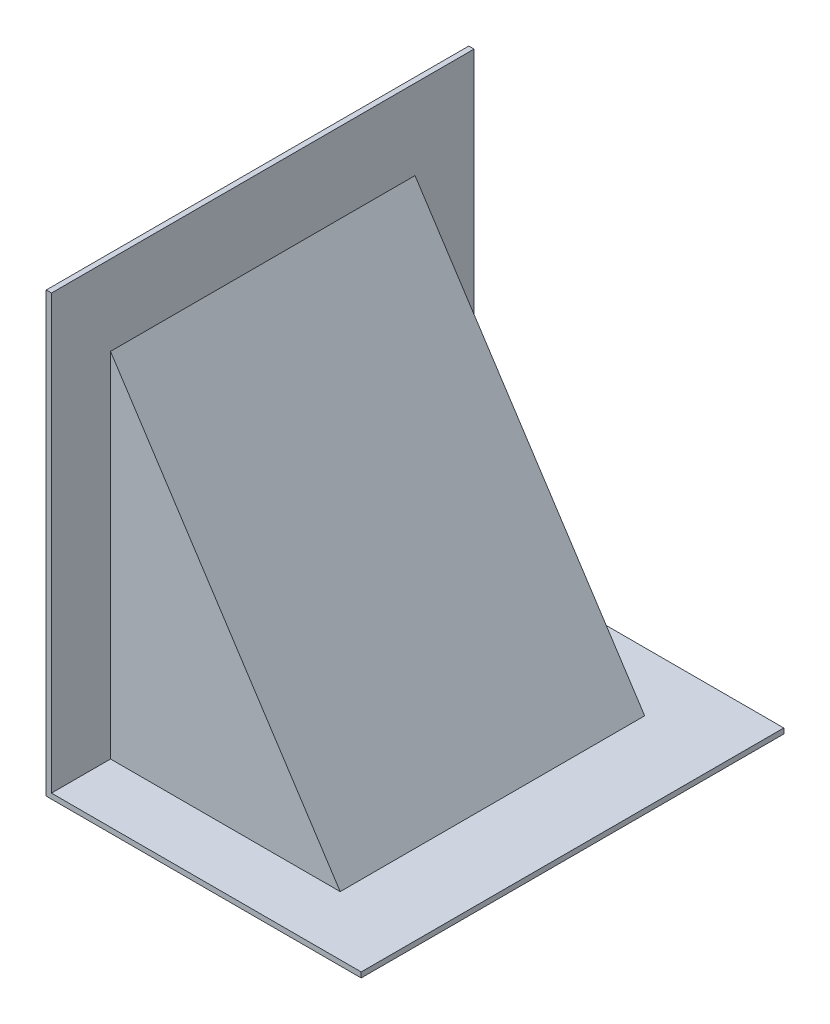
ISO-10303-21;
HEADER;
FILE_DESCRIPTION(('STEP AP214'),'2;1');
FILE_NAME('part.step','',(''),(''),'','','');
FILE_SCHEMA(('AUTOMOTIVE_DESIGN { 1 0 10303 214 1 1 1 1 }'));
ENDSEC;
DATA;
#1=APPLICATION_CONTEXT('core data for automotive mechanical design processes');
#2=APPLICATION_PROTOCOL_DEFINITION('international standard','automotive_design',2000,#1);
#3=PRODUCT_CONTEXT('',#1,'mechanical');
#4=PRODUCT('Part','Part','',(#3));
#5=PRODUCT_RELATED_PRODUCT_CATEGORY('part','',(#4));
#6=PRODUCT_DEFINITION_FORMATION('','',#4);
#7=PRODUCT_DEFINITION_CONTEXT('part definition',#1,'design');
#8=PRODUCT_DEFINITION('design','',#6,#7);
#9=PRODUCT_DEFINITION_SHAPE('','',#8);
#10=(LENGTH_UNIT() NAMED_UNIT(*) SI_UNIT(.MILLI.,.METRE.));
#11=(NAMED_UNIT(*) PLANE_ANGLE_UNIT() SI_UNIT($,.RADIAN.));
#12=(NAMED_UNIT(*) SI_UNIT($,.STERADIAN.) SOLID_ANGLE_UNIT());
#13=UNCERTAINTY_MEASURE_WITH_UNIT(LENGTH_MEASURE(1.E-05),#10,'distance_accuracy_value','');
#14=(GEOMETRIC_REPRESENTATION_CONTEXT(3) GLOBAL_UNCERTAINTY_ASSIGNED_CONTEXT((#13)) GLOBAL_UNIT_ASSIGNED_CONTEXT((#10,
#11,#12)) REPRESENTATION_CONTEXT('',''));
#15=CARTESIAN_POINT('',(0.,0.,0.));
#16=DIRECTION('',(0.,0.,1.));
#17=DIRECTION('',(1.,0.,0.));
#18=AXIS2_PLACEMENT_3D('',#15,#16,#17);
#19=CARTESIAN_POINT('',(87.4999999999999,0.,116.));
#20=DIRECTION('',(-0.838229970604211,-0.545316895374482,0.));
#21=DIRECTION('',(0.545316895374482,-0.838229970604211,0.));
#22=AXIS2_PLACEMENT_3D('',#19,#20,#21);
#23=PLANE('',#22);
#24=DIRECTION('',(-0.545316895374482,0.838229970604211,0.));
#25=VECTOR('',#24,1.);
#26=CARTESIAN_POINT('',(87.4999999999999,0.,0.));
#27=LINE('',#26,#25);
#28=CARTESIAN_POINT('',(87.4999999999999,0.,0.));
#29=VERTEX_POINT('',#28);
#30=CARTESIAN_POINT('',(5.62926775909469E-13,134.5,0.));
#31=VERTEX_POINT('',#30);
#32=EDGE_CURVE('E181',#29,#31,#27,.T.);
#33=ORIENTED_EDGE('',*,*,#32,.T.);
#34=DIRECTION('',(0.,0.,-1.));
#35=VECTOR('',#34,1.);
#36=CARTESIAN_POINT('',(5.62926775909469E-13,134.5,116.));
#37=LINE('',#36,#35);
#38=CARTESIAN_POINT('',(5.62926775909469E-13,134.5,116.));
#39=VERTEX_POINT('',#38);
#40=EDGE_CURVE('E47',#39,#31,#37,.T.);
#41=ORIENTED_EDGE('',*,*,#40,.F.);
#42=DIRECTION('',(-0.545316895374482,0.838229970604211,0.));
#43=VECTOR('',#42,1.);
#44=CARTESIAN_POINT('',(87.4999999999999,0.,116.));
#45=LINE('',#44,#43);
#46=CARTESIAN_POINT('',(87.4999999999999,0.,116.));
#47=VERTEX_POINT('',#46);
#48=EDGE_CURVE('E54',#47,#39,#45,.T.);
#49=ORIENTED_EDGE('',*,*,#48,.F.);
#50=DIRECTION('',(0.,0.,-1.));
#51=VECTOR('',#50,1.);
#52=CARTESIAN_POINT('',(87.4999999999999,0.,116.));
#53=LINE('',#52,#51);
#54=EDGE_CURVE('E11',#47,#29,#53,.T.);
#55=ORIENTED_EDGE('',*,*,#54,.T.);
#56=EDGE_LOOP('',(#33,#41,#49,#55));
#57=FACE_BOUND('',#56,.T.);
#58=ADVANCED_FACE('F39',(#57),#23,.F.);
#59=CARTESIAN_POINT('',(0.,0.,116.));
#60=DIRECTION('',(0.,0.,1.));
#61=DIRECTION('',(1.,0.,0.));
#62=AXIS2_PLACEMENT_3D('',#59,#60,#61);
#63=PLANE('',#62);
#64=DIRECTION('',(0.,-1.,0.));
#65=VECTOR('',#64,1.);
#66=CARTESIAN_POINT('',(5.62926775909469E-13,134.5,116.));
#67=LINE('',#66,#65);
#68=CARTESIAN_POINT('',(0.,0.,116.));
#69=VERTEX_POINT('',#68);
#70=EDGE_CURVE('E177',#39,#69,#67,.T.);
#71=ORIENTED_EDGE('',*,*,#70,.T.);
#72=DIRECTION('',(1.,0.,0.));
#73=VECTOR('',#72,1.);
#74=CARTESIAN_POINT('',(0.,0.,116.));
#75=LINE('',#74,#73);
#76=EDGE_CURVE('E180',#69,#47,#75,.T.);
#77=ORIENTED_EDGE('',*,*,#76,.T.);
#78=ORIENTED_EDGE('',*,*,#48,.T.);
#79=EDGE_LOOP('',(#71,#77,#78));
#80=FACE_BOUND('',#79,.T.);
#81=ADVANCED_FACE('F228',(#80),#63,.T.);
#82=CARTESIAN_POINT('',(0.,0.,0.));
#83=DIRECTION('',(0.,0.,1.));
#84=DIRECTION('',(1.,0.,0.));
#85=AXIS2_PLACEMENT_3D('',#82,#83,#84);
#86=PLANE('',#85);
#87=DIRECTION('',(0.,-1.,0.));
#88=VECTOR('',#87,1.);
#89=CARTESIAN_POINT('',(5.62926775909469E-13,134.5,0.));
#90=LINE('',#89,#88);
#91=CARTESIAN_POINT('',(0.,0.,0.));
#92=VERTEX_POINT('',#91);
#93=EDGE_CURVE('E176',#31,#92,#90,.T.);
#94=ORIENTED_EDGE('',*,*,#93,.F.);
#95=ORIENTED_EDGE('',*,*,#32,.F.);
#96=DIRECTION('',(1.,0.,0.));
#97=VECTOR('',#96,1.);
#98=CARTESIAN_POINT('',(0.,0.,0.));
#99=LINE('',#98,#97);
#100=EDGE_CURVE('E189',#92,#29,#99,.T.);
#101=ORIENTED_EDGE('',*,*,#100,.F.);
#102=EDGE_LOOP('',(#94,#95,#101));
#103=FACE_BOUND('',#102,.T.);
#104=ADVANCED_FACE('F203',(#103),#86,.F.);
#105=CARTESIAN_POINT('',(0.,0.,0.));
#106=DIRECTION('',(0.,-1.,0.));
#107=DIRECTION('',(0.,0.,-1.));
#108=AXIS2_PLACEMENT_3D('',#105,#106,#107);
#109=PLANE('',#108);
#110=DIRECTION('',(0.,0.,-1.));
#111=VECTOR('',#110,1.);
#112=CARTESIAN_POINT('',(0.,0.,-22.5));
#113=LINE('',#112,#111);
#114=CARTESIAN_POINT('',(0.,0.,-22.5));
#115=VERTEX_POINT('',#114);
#116=EDGE_CURVE('E138',#92,#115,#113,.T.);
#117=ORIENTED_EDGE('',*,*,#116,.F.);
#118=ORIENTED_EDGE('',*,*,#100,.T.);
#119=ORIENTED_EDGE('',*,*,#54,.F.);
#120=ORIENTED_EDGE('',*,*,#76,.F.);
#121=CARTESIAN_POINT('',(0.,0.,138.5));
#122=VERTEX_POINT('',#121);
#123=EDGE_CURVE('E143',#122,#69,#113,.T.);
#124=ORIENTED_EDGE('',*,*,#123,.F.);
#125=DIRECTION('',(-1.,0.,0.));
#126=VECTOR('',#125,1.);
#127=CARTESIAN_POINT('',(118.,0.,138.5));
#128=LINE('',#127,#126);
#129=CARTESIAN_POINT('',(118.,0.,138.5));
#130=VERTEX_POINT('',#129);
#131=EDGE_CURVE('E152',#130,#122,#128,.T.);
#132=ORIENTED_EDGE('',*,*,#131,.F.);
#133=DIRECTION('',(0.,0.,1.));
#134=VECTOR('',#133,1.);
#135=CARTESIAN_POINT('',(118.,0.,-22.5));
#136=LINE('',#135,#134);
#137=CARTESIAN_POINT('',(118.,0.,-22.5));
#138=VERTEX_POINT('',#137);
#139=EDGE_CURVE('E164',#138,#130,#136,.T.);
#140=ORIENTED_EDGE('',*,*,#139,.F.);
#141=DIRECTION('',(1.,0.,0.));
#142=VECTOR('',#141,1.);
#143=CARTESIAN_POINT('',(118.,0.,-22.5));
#144=LINE('',#143,#142);
#145=EDGE_CURVE('E161',#115,#138,#144,.T.);
#146=ORIENTED_EDGE('',*,*,#145,.F.);
#147=EDGE_LOOP('',(#117,#118,#119,#120,#124,#132,#140,#146));
#148=FACE_BOUND('',#147,.T.);
#149=ADVANCED_FACE('F204',(#148),#109,.F.);
#150=CARTESIAN_POINT('',(118.,-2.,-22.5));
#151=DIRECTION('',(0.,0.,1.));
#152=DIRECTION('',(1.,0.,0.));
#153=AXIS2_PLACEMENT_3D('',#150,#151,#152);
#154=PLANE('',#153);
#155=ORIENTED_EDGE('',*,*,#145,.T.);
#156=DIRECTION('',(0.,1.,0.));
#157=VECTOR('',#156,1.);
#158=CARTESIAN_POINT('',(118.,-2.,-22.5));
#159=LINE('',#158,#157);
#160=CARTESIAN_POINT('',(118.,-2.,-22.5));
#161=VERTEX_POINT('',#160);
#162=EDGE_CURVE('E172',#161,#138,#159,.T.);
#163=ORIENTED_EDGE('',*,*,#162,.F.);
#164=DIRECTION('',(1.,0.,0.));
#165=VECTOR('',#164,1.);
#166=CARTESIAN_POINT('',(118.,-2.,-22.5));
#167=LINE('',#166,#165);
#168=CARTESIAN_POINT('',(-2.00000000000001,-1.99999999999999,-22.5));
#169=VERTEX_POINT('',#168);
#170=EDGE_CURVE('E148',#169,#161,#167,.T.);
#171=ORIENTED_EDGE('',*,*,#170,.F.);
#172=DIRECTION('',(0.,-1.,0.));
#173=VECTOR('',#172,1.);
#174=CARTESIAN_POINT('',(-1.99999999999931,165.,-22.5));
#175=LINE('',#174,#173);
#176=CARTESIAN_POINT('',(-1.99999999999931,165.,-22.5));
#177=VERTEX_POINT('',#176);
#178=EDGE_CURVE('E120',#177,#169,#175,.T.);
#179=ORIENTED_EDGE('',*,*,#178,.F.);
#180=DIRECTION('',(1.,0.,0.));
#181=VECTOR('',#180,1.);
#182=CARTESIAN_POINT('',(-1.99999999999931,165.,-22.5));
#183=LINE('',#182,#181);
#184=CARTESIAN_POINT('',(6.90579316171467E-13,165.,-22.5));
#185=VERTEX_POINT('',#184);
#186=EDGE_CURVE('E115',#177,#185,#183,.T.);
#187=ORIENTED_EDGE('',*,*,#186,.T.);
#188=DIRECTION('',(0.,-1.,0.));
#189=VECTOR('',#188,1.);
#190=CARTESIAN_POINT('',(6.90579316171467E-13,165.,-22.5));
#191=LINE('',#190,#189);
#192=EDGE_CURVE('E131',#185,#115,#191,.T.);
#193=ORIENTED_EDGE('',*,*,#192,.T.);
#194=EDGE_LOOP('',(#155,#163,#171,#179,#187,#193));
#195=FACE_BOUND('',#194,.T.);
#196=ADVANCED_FACE('F209',(#195),#154,.F.);
#197=CARTESIAN_POINT('',(118.,-2.,-22.5));
#198=DIRECTION('',(-1.,0.,0.));
#199=DIRECTION('',(0.,0.,1.));
#200=AXIS2_PLACEMENT_3D('',#197,#198,#199);
#201=PLANE('',#200);
#202=ORIENTED_EDGE('',*,*,#139,.T.);
#203=DIRECTION('',(0.,1.,0.));
#204=VECTOR('',#203,1.);
#205=CARTESIAN_POINT('',(118.,-2.,138.5));
#206=LINE('',#205,#204);
#207=CARTESIAN_POINT('',(118.,-2.,138.5));
#208=VERTEX_POINT('',#207);
#209=EDGE_CURVE('E157',#208,#130,#206,.T.);
#210=ORIENTED_EDGE('',*,*,#209,.F.);
#211=DIRECTION('',(0.,0.,1.));
#212=VECTOR('',#211,1.);
#213=CARTESIAN_POINT('',(118.,-2.,-22.5));
#214=LINE('',#213,#212);
#215=EDGE_CURVE('E151',#161,#208,#214,.T.);
#216=ORIENTED_EDGE('',*,*,#215,.F.);
#217=ORIENTED_EDGE('',*,*,#162,.T.);
#218=EDGE_LOOP('',(#202,#210,#216,#217));
#219=FACE_BOUND('',#218,.T.);
#220=ADVANCED_FACE('F238',(#219),#201,.F.);
#221=CARTESIAN_POINT('',(118.,-2.,138.5));
#222=DIRECTION('',(0.,0.,-1.));
#223=DIRECTION('',(-1.,0.,0.));
#224=AXIS2_PLACEMENT_3D('',#221,#222,#223);
#225=PLANE('',#224);
#226=ORIENTED_EDGE('',*,*,#131,.T.);
#227=DIRECTION('',(0.,1.,0.));
#228=VECTOR('',#227,1.);
#229=CARTESIAN_POINT('',(6.90579316171467E-13,165.,138.5));
#230=LINE('',#229,#228);
#231=CARTESIAN_POINT('',(6.90579316171467E-13,165.,138.5));
#232=VERTEX_POINT('',#231);
#233=EDGE_CURVE('E135',#122,#232,#230,.T.);
#234=ORIENTED_EDGE('',*,*,#233,.T.);
#235=DIRECTION('',(1.,0.,0.));
#236=VECTOR('',#235,1.);
#237=CARTESIAN_POINT('',(-1.99999999999931,165.,138.5));
#238=LINE('',#237,#236);
#239=CARTESIAN_POINT('',(-1.99999999999931,165.,138.5));
#240=VERTEX_POINT('',#239);
#241=EDGE_CURVE('E113',#240,#232,#238,.T.);
#242=ORIENTED_EDGE('',*,*,#241,.F.);
#243=DIRECTION('',(0.,1.,0.));
#244=VECTOR('',#243,1.);
#245=CARTESIAN_POINT('',(-1.99999999999931,165.,138.5));
#246=LINE('',#245,#244);
#247=CARTESIAN_POINT('',(-2.00000000000001,-1.99999999999999,138.5));
#248=VERTEX_POINT('',#247);
#249=EDGE_CURVE('E121',#248,#240,#246,.T.);
#250=ORIENTED_EDGE('',*,*,#249,.F.);
#251=DIRECTION('',(-1.,0.,0.));
#252=VECTOR('',#251,1.);
#253=CARTESIAN_POINT('',(118.,-2.,138.5));
#254=LINE('',#253,#252);
#255=EDGE_CURVE('E155',#208,#248,#254,.T.);
#256=ORIENTED_EDGE('',*,*,#255,.F.);
#257=ORIENTED_EDGE('',*,*,#209,.T.);
#258=EDGE_LOOP('',(#226,#234,#242,#250,#256,#257));
#259=FACE_BOUND('',#258,.T.);
#260=ADVANCED_FACE('F133',(#259),#225,.F.);
#261=CARTESIAN_POINT('',(0.,-2.,0.));
#262=DIRECTION('',(0.,-1.,0.));
#263=DIRECTION('',(0.,0.,-1.));
#264=AXIS2_PLACEMENT_3D('',#261,#262,#263);
#265=PLANE('',#264);
#266=ORIENTED_EDGE('',*,*,#255,.T.);
#267=DIRECTION('',(0.,0.,1.));
#268=VECTOR('',#267,1.);
#269=CARTESIAN_POINT('',(-2.00000000000001,-1.99999999999999,-22.5));
#270=LINE('',#269,#268);
#271=EDGE_CURVE('E127',#169,#248,#270,.T.);
#272=ORIENTED_EDGE('',*,*,#271,.F.);
#273=ORIENTED_EDGE('',*,*,#170,.T.);
#274=ORIENTED_EDGE('',*,*,#215,.T.);
#275=EDGE_LOOP('',(#266,#272,#273,#274));
#276=FACE_BOUND('',#275,.T.);
#277=ADVANCED_FACE('F222',(#276),#265,.T.);
#278=CARTESIAN_POINT('',(0.,0.,0.));
#279=DIRECTION('',(-1.,0.,0.));
#280=DIRECTION('',(0.,-1.,0.));
#281=AXIS2_PLACEMENT_3D('',#278,#279,#280);
#282=PLANE('',#281);
#283=ORIENTED_EDGE('',*,*,#93,.T.);
#284=ORIENTED_EDGE('',*,*,#116,.T.);
#285=ORIENTED_EDGE('',*,*,#192,.F.);
#286=DIRECTION('',(0.,0.,-1.));
#287=VECTOR('',#286,1.);
#288=CARTESIAN_POINT('',(6.90579316171467E-13,165.,-22.5));
#289=LINE('',#288,#287);
#290=EDGE_CURVE('E212',#232,#185,#289,.T.);
#291=ORIENTED_EDGE('',*,*,#290,.F.);
#292=ORIENTED_EDGE('',*,*,#233,.F.);
#293=ORIENTED_EDGE('',*,*,#123,.T.);
#294=ORIENTED_EDGE('',*,*,#70,.F.);
#295=ORIENTED_EDGE('',*,*,#40,.T.);
#296=EDGE_LOOP('',(#283,#284,#285,#291,#292,#293,#294,#295));
#297=FACE_BOUND('',#296,.T.);
#298=ADVANCED_FACE('F198',(#297),#282,.F.);
#299=CARTESIAN_POINT('',(-1.99999999999931,165.,-22.5));
#300=DIRECTION('',(0.,-1.,0.));
#301=DIRECTION('',(1.,0.,0.));
#302=AXIS2_PLACEMENT_3D('',#299,#300,#301);
#303=PLANE('',#302);
#304=ORIENTED_EDGE('',*,*,#290,.T.);
#305=ORIENTED_EDGE('',*,*,#186,.F.);
#306=DIRECTION('',(0.,0.,-1.));
#307=VECTOR('',#306,1.);
#308=CARTESIAN_POINT('',(-1.99999999999931,165.,-22.5));
#309=LINE('',#308,#307);
#310=EDGE_CURVE('E109',#240,#177,#309,.T.);
#311=ORIENTED_EDGE('',*,*,#310,.F.);
#312=ORIENTED_EDGE('',*,*,#241,.T.);
#313=EDGE_LOOP('',(#304,#305,#311,#312));
#314=FACE_BOUND('',#313,.T.);
#315=ADVANCED_FACE('F111',(#314),#303,.F.);
#316=CARTESIAN_POINT('',(-2.,0.,0.));
#317=DIRECTION('',(-1.,0.,0.));
#318=DIRECTION('',(0.,-1.,0.));
#319=AXIS2_PLACEMENT_3D('',#316,#317,#318);
#320=PLANE('',#319);
#321=ORIENTED_EDGE('',*,*,#249,.T.);
#322=ORIENTED_EDGE('',*,*,#310,.T.);
#323=ORIENTED_EDGE('',*,*,#178,.T.);
#324=ORIENTED_EDGE('',*,*,#271,.T.);
#325=EDGE_LOOP('',(#321,#322,#323,#324));
#326=FACE_BOUND('',#325,.T.);
#327=ADVANCED_FACE('F125',(#326),#320,.T.);
#328=CLOSED_SHELL('',(#58,#81,#104,#149,#196,#220,#260,#277,#298,#315,#327));
#329=MANIFOLD_SOLID_BREP('B2',#328);
#330=ADVANCED_BREP_SHAPE_REPRESENTATION('',(#18,#329),#14);
#331=SHAPE_DEFINITION_REPRESENTATION(#9,#330);
ENDSEC;
END-ISO-10303-21;
